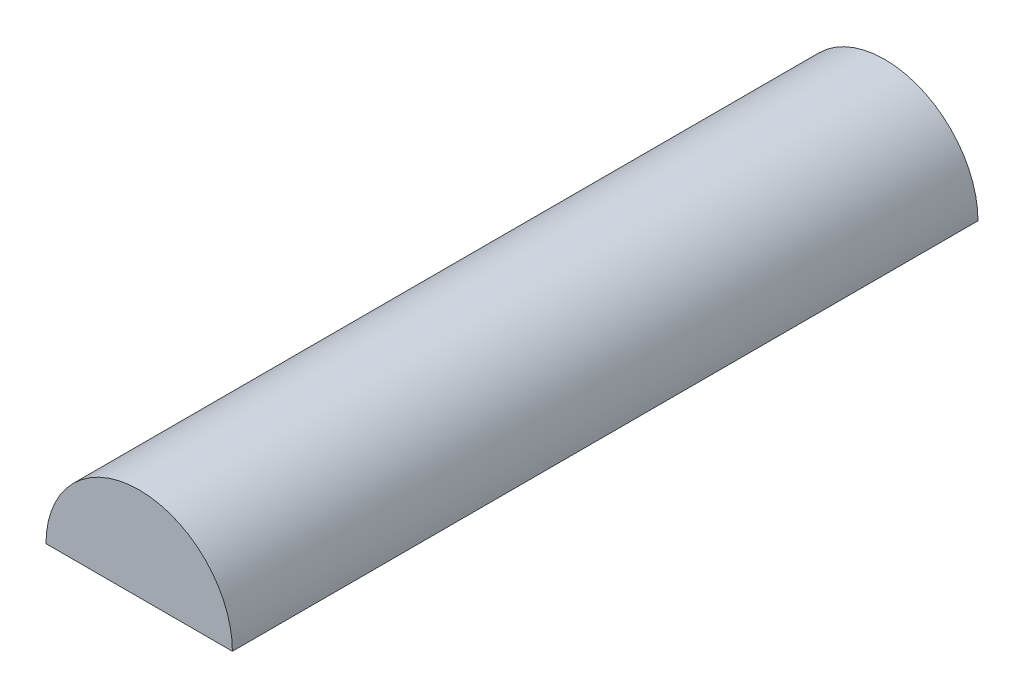
ISO-10303-21;
HEADER;
FILE_DESCRIPTION(('STEP AP214'),'2;1');
FILE_NAME('part.step','',(''),(''),'','','');
FILE_SCHEMA(('AUTOMOTIVE_DESIGN { 1 0 10303 214 1 1 1 1 }'));
ENDSEC;
DATA;
#1=APPLICATION_CONTEXT('core data for automotive mechanical design processes');
#2=APPLICATION_PROTOCOL_DEFINITION('international standard','automotive_design',2000,#1);
#3=PRODUCT_CONTEXT('',#1,'mechanical');
#4=PRODUCT('Part','Part','',(#3));
#5=PRODUCT_RELATED_PRODUCT_CATEGORY('part','',(#4));
#6=PRODUCT_DEFINITION_FORMATION('','',#4);
#7=PRODUCT_DEFINITION_CONTEXT('part definition',#1,'design');
#8=PRODUCT_DEFINITION('design','',#6,#7);
#9=PRODUCT_DEFINITION_SHAPE('','',#8);
#10=(LENGTH_UNIT() NAMED_UNIT(*) SI_UNIT(.MILLI.,.METRE.));
#11=(NAMED_UNIT(*) PLANE_ANGLE_UNIT() SI_UNIT($,.RADIAN.));
#12=(NAMED_UNIT(*) SI_UNIT($,.STERADIAN.) SOLID_ANGLE_UNIT());
#13=UNCERTAINTY_MEASURE_WITH_UNIT(LENGTH_MEASURE(1.E-05),#10,'distance_accuracy_value','');
#14=(GEOMETRIC_REPRESENTATION_CONTEXT(3) GLOBAL_UNCERTAINTY_ASSIGNED_CONTEXT((#13)) GLOBAL_UNIT_ASSIGNED_CONTEXT((#10,
#11,#12)) REPRESENTATION_CONTEXT('',''));
#15=CARTESIAN_POINT('',(0.,0.,0.));
#16=DIRECTION('',(0.,0.,1.));
#17=DIRECTION('',(1.,0.,0.));
#18=AXIS2_PLACEMENT_3D('',#15,#16,#17);
#19=CARTESIAN_POINT('',(12.5,0.,100.));
#20=DIRECTION('',(0.,0.,-1.));
#21=DIRECTION('',(-1.,0.,0.));
#22=AXIS2_PLACEMENT_3D('',#19,#20,#21);
#23=CYLINDRICAL_SURFACE('',#22,12.5);
#24=CARTESIAN_POINT('',(12.5,0.,0.));
#25=DIRECTION('',(0.,0.,1.));
#26=DIRECTION('',(1.,0.,0.));
#27=AXIS2_PLACEMENT_3D('',#24,#25,#26);
#28=CIRCLE('',#27,12.5);
#29=CARTESIAN_POINT('',(0.,0.,0.));
#30=VERTEX_POINT('',#29);
#31=CARTESIAN_POINT('',(25.,0.,0.));
#32=VERTEX_POINT('',#31);
#33=EDGE_CURVE('E65',#30,#32,#28,.F.);
#34=ORIENTED_EDGE('',*,*,#33,.F.);
#35=DIRECTION('',(0.,0.,-1.));
#36=VECTOR('',#35,1.);
#37=CARTESIAN_POINT('',(0.,0.,100.));
#38=LINE('',#37,#36);
#39=CARTESIAN_POINT('',(0.,0.,100.));
#40=VERTEX_POINT('',#39);
#41=EDGE_CURVE('E11',#40,#30,#38,.T.);
#42=ORIENTED_EDGE('',*,*,#41,.F.);
#43=CARTESIAN_POINT('',(12.5,0.,100.));
#44=DIRECTION('',(0.,0.,1.));
#45=DIRECTION('',(1.,0.,0.));
#46=AXIS2_PLACEMENT_3D('',#43,#44,#45);
#47=CIRCLE('',#46,12.5);
#48=CARTESIAN_POINT('',(25.,0.,100.));
#49=VERTEX_POINT('',#48);
#50=EDGE_CURVE('E66',#40,#49,#47,.F.);
#51=ORIENTED_EDGE('',*,*,#50,.T.);
#52=DIRECTION('',(0.,0.,-1.));
#53=VECTOR('',#52,1.);
#54=CARTESIAN_POINT('',(25.,0.,100.));
#55=LINE('',#54,#53);
#56=EDGE_CURVE('E45',#49,#32,#55,.T.);
#57=ORIENTED_EDGE('',*,*,#56,.T.);
#58=EDGE_LOOP('',(#34,#42,#51,#57));
#59=FACE_BOUND('',#58,.T.);
#60=ADVANCED_FACE('F37',(#59),#23,.T.);
#61=CARTESIAN_POINT('',(0.,0.,100.));
#62=DIRECTION('',(0.,1.,0.));
#63=DIRECTION('',(0.,0.,1.));
#64=AXIS2_PLACEMENT_3D('',#61,#62,#63);
#65=PLANE('',#64);
#66=DIRECTION('',(1.,0.,0.));
#67=VECTOR('',#66,1.);
#68=CARTESIAN_POINT('',(0.,0.,0.));
#69=LINE('',#68,#67);
#70=EDGE_CURVE('E67',#30,#32,#69,.T.);
#71=ORIENTED_EDGE('',*,*,#70,.T.);
#72=ORIENTED_EDGE('',*,*,#56,.F.);
#73=DIRECTION('',(1.,0.,0.));
#74=VECTOR('',#73,1.);
#75=CARTESIAN_POINT('',(0.,0.,100.));
#76=LINE('',#75,#74);
#77=EDGE_CURVE('E52',#40,#49,#76,.T.);
#78=ORIENTED_EDGE('',*,*,#77,.F.);
#79=ORIENTED_EDGE('',*,*,#41,.T.);
#80=EDGE_LOOP('',(#71,#72,#78,#79));
#81=FACE_BOUND('',#80,.T.);
#82=ADVANCED_FACE('F68',(#81),#65,.F.);
#83=CARTESIAN_POINT('',(0.,0.,100.));
#84=DIRECTION('',(0.,0.,1.));
#85=DIRECTION('',(1.,0.,0.));
#86=AXIS2_PLACEMENT_3D('',#83,#84,#85);
#87=PLANE('',#86);
#88=ORIENTED_EDGE('',*,*,#50,.F.);
#89=ORIENTED_EDGE('',*,*,#77,.T.);
#90=EDGE_LOOP('',(#88,#89));
#91=FACE_BOUND('',#90,.T.);
#92=ADVANCED_FACE('F76',(#91),#87,.T.);
#93=CARTESIAN_POINT('',(0.,0.,0.));
#94=DIRECTION('',(0.,0.,1.));
#95=DIRECTION('',(1.,0.,0.));
#96=AXIS2_PLACEMENT_3D('',#93,#94,#95);
#97=PLANE('',#96);
#98=ORIENTED_EDGE('',*,*,#33,.T.);
#99=ORIENTED_EDGE('',*,*,#70,.F.);
#100=EDGE_LOOP('',(#98,#99));
#101=FACE_BOUND('',#100,.T.);
#102=ADVANCED_FACE('F71',(#101),#97,.F.);
#103=CLOSED_SHELL('',(#60,#82,#92,#102));
#104=MANIFOLD_SOLID_BREP('B2',#103);
#105=ADVANCED_BREP_SHAPE_REPRESENTATION('',(#18,#104),#14);
#106=SHAPE_DEFINITION_REPRESENTATION(#9,#105);
ENDSEC;
END-ISO-10303-21;
